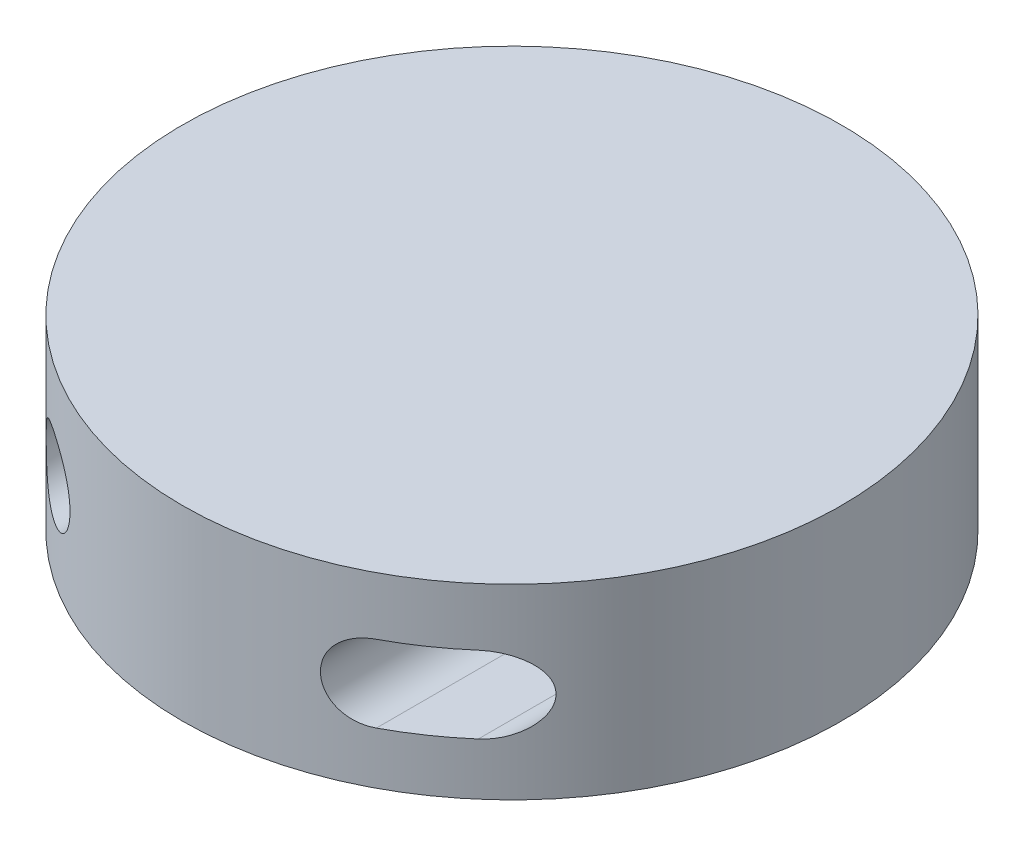
ISO-10303-21;
HEADER;
FILE_DESCRIPTION(('STEP AP214'),'2;1');
FILE_NAME('part.step','',(''),(''),'','','');
FILE_SCHEMA(('AUTOMOTIVE_DESIGN { 1 0 10303 214 1 1 1 1 }'));
ENDSEC;
DATA;
#1=APPLICATION_CONTEXT('core data for automotive mechanical design processes');
#2=APPLICATION_PROTOCOL_DEFINITION('international standard','automotive_design',2000,#1);
#3=PRODUCT_CONTEXT('',#1,'mechanical');
#4=PRODUCT('Part','Part','',(#3));
#5=PRODUCT_RELATED_PRODUCT_CATEGORY('part','',(#4));
#6=PRODUCT_DEFINITION_FORMATION('','',#4);
#7=PRODUCT_DEFINITION_CONTEXT('part definition',#1,'design');
#8=PRODUCT_DEFINITION('design','',#6,#7);
#9=PRODUCT_DEFINITION_SHAPE('','',#8);
#10=(LENGTH_UNIT() NAMED_UNIT(*) SI_UNIT(.MILLI.,.METRE.));
#11=(NAMED_UNIT(*) PLANE_ANGLE_UNIT() SI_UNIT($,.RADIAN.));
#12=(NAMED_UNIT(*) SI_UNIT($,.STERADIAN.) SOLID_ANGLE_UNIT());
#13=UNCERTAINTY_MEASURE_WITH_UNIT(LENGTH_MEASURE(1.E-05),#10,'distance_accuracy_value','');
#14=(GEOMETRIC_REPRESENTATION_CONTEXT(3) GLOBAL_UNCERTAINTY_ASSIGNED_CONTEXT((#13)) GLOBAL_UNIT_ASSIGNED_CONTEXT((#10,
#11,#12)) REPRESENTATION_CONTEXT('',''));
#15=CARTESIAN_POINT('',(0.,0.,0.));
#16=DIRECTION('',(0.,0.,1.));
#17=DIRECTION('',(1.,0.,0.));
#18=AXIS2_PLACEMENT_3D('',#15,#16,#17);
#19=CARTESIAN_POINT('',(0.,17.,0.));
#20=DIRECTION('',(0.,-1.,0.));
#21=DIRECTION('',(0.,0.,-1.));
#22=AXIS2_PLACEMENT_3D('',#19,#20,#21);
#23=CYLINDRICAL_SURFACE('',#22,30.);
#24=CARTESIAN_POINT('',(-13.375,8.25,26.8534797558901));
#25=CARTESIAN_POINT('',(-13.3750006085543,8.15989832893413,26.8534795461278));
#26=CARTESIAN_POINT('',(-13.378484547308,8.06976448026353,26.8517450740264));
#27=CARTESIAN_POINT('',(-13.3923834220039,7.89012802276604,26.8448155995292));
#28=CARTESIAN_POINT('',(-13.402802792603,7.80062585487796,26.8396183829817));
#29=CARTESIAN_POINT('',(-13.4304858445202,7.62275725371299,26.8257766209072));
#30=CARTESIAN_POINT('',(-13.4477635779207,7.53439353920119,26.8171249974394));
#31=CARTESIAN_POINT('',(-13.4889544337503,7.35962123018778,26.7964294711437));
#32=CARTESIAN_POINT('',(-13.5128702044937,7.27321343093105,26.7843842143614));
#33=CARTESIAN_POINT('',(-13.5940353256864,7.01837474826386,26.7433341383886));
#34=CARTESIAN_POINT('',(-13.6608109903343,6.85364543359958,26.709361660511));
#35=CARTESIAN_POINT('',(-13.8168012697818,6.53875871413869,26.6289999991809));
#36=CARTESIAN_POINT('',(-13.9060050911439,6.38859434806712,26.582616787644));
#37=CARTESIAN_POINT('',(-14.1067057308018,6.10097609463532,26.4766712199183));
#38=CARTESIAN_POINT('',(-14.2188522167683,5.9641206721476,26.4167175877796));
#39=CARTESIAN_POINT('',(-14.4592285704137,5.71139639870356,26.2859169042239));
#40=CARTESIAN_POINT('',(-14.5874648115339,5.5955359089179,26.2150655334906));
#41=CARTESIAN_POINT('',(-14.8688479498061,5.3759455329429,26.0565888058858));
#42=CARTESIAN_POINT('',(-15.0232045441075,5.27446250540006,25.9680047851412));
#43=CARTESIAN_POINT('',(-15.3413126852528,5.09866990538831,25.781353601983));
#44=CARTESIAN_POINT('',(-15.5050686321898,5.02437318158694,25.6832819831969));
#45=CARTESIAN_POINT('',(-15.8597634303481,4.89447772221324,25.465989338309));
#46=CARTESIAN_POINT('',(-16.0514260835634,4.84266791668128,25.3456886805502));
#47=CARTESIAN_POINT('',(-16.4361362641726,4.77211231735737,25.097926305013));
#48=CARTESIAN_POINT('',(-16.6291843790085,4.7533814964709,24.9704613713101));
#49=CARTESIAN_POINT('',(-17.0403806308222,4.74702562010607,24.6920142608062));
#50=CARTESIAN_POINT('',(-17.2581132663381,4.76430017945123,24.5403003661391));
#51=CARTESIAN_POINT('',(-17.6851978459055,4.83816339624804,24.2343345258666));
#52=CARTESIAN_POINT('',(-17.8945401877523,4.89479581004366,24.0800799421641));
#53=CARTESIAN_POINT('',(-18.321210394306,5.05382446177827,23.7573538790111));
#54=CARTESIAN_POINT('',(-18.5371499827713,5.16032371103248,23.589049489279));
#55=CARTESIAN_POINT('',(-18.9471732475285,5.4189643272931,23.2609826602666));
#56=CARTESIAN_POINT('',(-19.1412797024555,5.57105750692799,23.1012114114778));
#57=CARTESIAN_POINT('',(-19.4479991670684,5.87062206536827,22.8430149986638));
#58=CARTESIAN_POINT('',(-19.5679732585505,6.00678452394128,22.740183400783));
#59=CARTESIAN_POINT('',(-19.7888125603394,6.30227846617808,22.5482633638481));
#60=CARTESIAN_POINT('',(-19.889709761342,6.4615703555877,22.4591519643737));
#61=CARTESIAN_POINT('',(-20.0492221270893,6.76754662629084,22.3167596806831));
#62=CARTESIAN_POINT('',(-20.1122632577135,6.91020206948808,22.2598775729525));
#63=CARTESIAN_POINT('',(-20.1929464269122,7.13308696830649,22.186622812435));
#64=CARTESIAN_POINT('',(-20.2175319781993,7.20888488972842,22.1642120154209));
#65=CARTESIAN_POINT('',(-20.2617039251027,7.36306320080592,22.1238389767591));
#66=CARTESIAN_POINT('',(-20.2812925451464,7.44144242376584,22.1058747557853));
#67=CARTESIAN_POINT('',(-20.3152633562353,7.60093186261333,22.0746599739961));
#68=CARTESIAN_POINT('',(-20.32960240696,7.68205897295832,22.0614484852833));
#69=CARTESIAN_POINT('',(-20.3525591696462,7.84576003684197,22.0402717698372));
#70=CARTESIAN_POINT('',(-20.3611796325105,7.92833327507659,22.0323040206398));
#71=CARTESIAN_POINT('',(-20.372518826463,8.09421951699231,22.0218196212186));
#72=CARTESIAN_POINT('',(-20.3752387523999,8.17753236747157,22.0193018673803));
#73=CARTESIAN_POINT('',(-20.3747278335006,8.34409617273757,22.0197742270904));
#74=CARTESIAN_POINT('',(-20.3714975497451,8.42734713261982,22.0227638213181));
#75=CARTESIAN_POINT('',(-20.3544239445001,8.65613696709693,22.0385503723705));
#76=CARTESIAN_POINT('',(-20.3343775374624,8.8008951962887,22.0570768934089));
#77=CARTESIAN_POINT('',(-20.2772667575004,9.08396493848451,22.1095886778627));
#78=CARTESIAN_POINT('',(-20.2401995051012,9.22227535632742,22.1435765569201));
#79=CARTESIAN_POINT('',(-20.1492359762182,9.49536530556049,22.2263851901351));
#80=CARTESIAN_POINT('',(-20.0947079617872,9.6297631786597,22.2757605032959));
#81=CARTESIAN_POINT('',(-19.9718626091719,9.88701263083299,22.3859672140823));
#82=CARTESIAN_POINT('',(-19.9035355204372,10.0098559548868,22.4468067103563));
#83=CARTESIAN_POINT('',(-19.7172593987128,10.3031205218631,22.6108793674696));
#84=CARTESIAN_POINT('',(-19.591837358874,10.465615017751,22.7198479627103));
#85=CARTESIAN_POINT('',(-19.3206815918222,10.7617942659808,22.950885218943));
#86=CARTESIAN_POINT('',(-19.1749115636024,10.8954264176926,23.0729772006289));
#87=CARTESIAN_POINT('',(-18.8647832025201,11.1361674007112,23.3272559273983));
#88=CARTESIAN_POINT('',(-18.7001328696394,11.2427445590179,23.4595867954707));
#89=CARTESIAN_POINT('',(-18.358171105796,11.4261390356851,23.728145788852));
#90=CARTESIAN_POINT('',(-18.1808623994736,11.502962735566,23.8643730717196));
#91=CARTESIAN_POINT('',(-17.7785293910172,11.6393394849644,24.1660788196871));
#92=CARTESIAN_POINT('',(-17.5512565570691,11.691966666733,24.3317422913823));
#93=CARTESIAN_POINT('',(-17.087893219412,11.7513331852091,24.6593722410742));
#94=CARTESIAN_POINT('',(-16.8517940233101,11.7580260203218,24.8213348072436));
#95=CARTESIAN_POINT('',(-16.3718661410268,11.7221593472552,25.1405349350899));
#96=CARTESIAN_POINT('',(-16.1279829649205,11.6784900174798,25.297584613309));
#97=CARTESIAN_POINT('',(-15.767872588893,11.5726406592427,25.5224305546512));
#98=CARTESIAN_POINT('',(-15.6488128402989,11.5306464936307,25.5955767292465));
#99=CARTESIAN_POINT('',(-15.4139142320196,11.4329874849099,25.7377164328236));
#100=CARTESIAN_POINT('',(-15.2980741795603,11.3773277815766,25.8067115109641));
#101=CARTESIAN_POINT('',(-15.0179672254839,11.2227984959595,25.971095694598));
#102=CARTESIAN_POINT('',(-14.8563694741901,11.1158917646692,26.0637503451786));
#103=CARTESIAN_POINT('',(-14.6261835229816,10.93373695706,26.1931785651612));
#104=CARTESIAN_POINT('',(-14.5514711801066,10.8693655997219,26.2347390944075));
#105=CARTESIAN_POINT('',(-14.4068339960645,10.733541486684,26.3144432146666));
#106=CARTESIAN_POINT('',(-14.3369068847318,10.6620921287988,26.3525884286281));
#107=CARTESIAN_POINT('',(-14.2022187318668,10.5119627032911,26.4254212854107));
#108=CARTESIAN_POINT('',(-14.1374911752455,10.4332418542447,26.4600868284093));
#109=CARTESIAN_POINT('',(-14.0144984343222,10.2694096508556,26.5254345998643));
#110=CARTESIAN_POINT('',(-13.9562303316726,10.1843012117794,26.5561186282254));
#111=CARTESIAN_POINT('',(-13.8468751115323,10.0081837424929,26.6133023567091));
#112=CARTESIAN_POINT('',(-13.7957921028788,9.91717137920437,26.6397996636908));
#113=CARTESIAN_POINT('',(-13.7015838686467,9.73000080543968,26.6883759537258));
#114=CARTESIAN_POINT('',(-13.6584573480439,9.6338434356742,26.7104556558525));
#115=CARTESIAN_POINT('',(-13.5848360535342,9.44741375863056,26.7479673009565));
#116=CARTESIAN_POINT('',(-13.5534950775508,9.35756544260158,26.7638512114824));
#117=CARTESIAN_POINT('',(-13.498118803225,9.17507407255906,26.7918224977481));
#118=CARTESIAN_POINT('',(-13.4740825936254,9.08243136872694,26.8039103470463));
#119=CARTESIAN_POINT('',(-13.4336821205048,8.89534275060593,26.824181154422));
#120=CARTESIAN_POINT('',(-13.4172969732283,8.80090248584353,26.8323747430811));
#121=CARTESIAN_POINT('',(-13.3923268204297,8.61078722391534,26.8448464223469));
#122=CARTESIAN_POINT('',(-13.3837362000981,8.51511316598419,26.8491273314796));
#123=CARTESIAN_POINT('',(-13.3777296321615,8.39105876874744,26.8521200350975));
#124=CARTESIAN_POINT('',(-13.376706291332,8.36286009712272,26.8526298397703));
#125=CARTESIAN_POINT('',(-13.3753413796651,8.3064420026932,26.8533097331568));
#126=CARTESIAN_POINT('',(-13.3749998093823,8.27822257987154,26.853479821594));
#127=CARTESIAN_POINT('',(-13.375,8.25,26.8534797558901));
#128=B_SPLINE_CURVE_WITH_KNOTS('',3,(#24,#25,#26,#27,#28,#29,#30,#31,#32,#33,#34,#35,#36,#37,
#38,#39,#40,#41,#42,#43,#44,#45,#46,#47,#48,#49,#50,#51,#52,#53,#54,#55,#56,#57,#58,#59,#60,#61,
#62,#63,#64,#65,#66,#67,#68,#69,#70,#71,#72,#73,#74,#75,#76,#77,#78,#79,#80,#81,#82,#83,#84,#85,
#86,#87,#88,#89,#90,#91,#92,#93,#94,#95,#96,#97,#98,#99,#100,#101,#102,#103,#104,#105,#106,#107,
#108,#109,#110,#111,#112,#113,#114,#115,#116,#117,#118,#119,#120,#121,#122,#123,#124,#125,#126,
#127),.UNSPECIFIED.,.T.,.F.,(4,2,2,2,2,2,2,2,2,2,2,2,2,2,2,2,2,2,2,2,2,2,2,2,2,2,2,2,2,2,2,2,2,
2,2,2,2,2,2,2,2,2,2,2,2,2,2,2,2,2,2,4),(0.,0.270276437010964,0.540725860531264,
0.811732291287802,1.08284699868935,1.62302165554073,2.16293685197357,2.72103729442579,
3.27935951260759,3.89151665144005,4.50396273266137,5.197670754637,5.89169269691956,
6.68626164276179,7.48171537175726,8.35887117309342,9.23510317381119,9.85871882477261,
10.481279253418,10.9771733087022,11.2252398826844,11.4731958341965,11.7231459978447,
11.9729758366574,12.2227550806276,12.4725107726285,12.9122117185885,13.3519870776883,
13.8099227472351,14.2681831375948,14.9615641903012,15.6561984382172,16.3635786304234,
17.0708070196229,17.925280689476,18.7806192575573,19.6551728337727,20.0922642596322,
20.5291915412378,21.1703176258005,21.491056561816,21.8116422655174,22.1341499414025,
22.4565113110159,22.779056281798,23.1015487076953,23.3905934923782,23.6796022044035,
23.967817381411,24.2558247765823,24.3404834964021,24.4251422850872),.UNSPECIFIED.);
#129=CARTESIAN_POINT('',(-13.375,8.25,26.8534797558901));
#130=VERTEX_POINT('',#129);
#131=EDGE_CURVE('E36',#130,#130,#128,.T.);
#132=ORIENTED_EDGE('',*,*,#131,.T.);
#133=EDGE_LOOP('',(#132));
#134=FACE_BOUND('',#133,.T.);
#135=CARTESIAN_POINT('',(0.,4.75,0.));
#136=DIRECTION('',(0.,-1.,0.));
#137=DIRECTION('',(1.,0.,0.));
#138=AXIS2_PLACEMENT_3D('',#135,#136,#137);
#139=CIRCLE('',#138,30.);
#140=CARTESIAN_POINT('',(19.625,4.75,22.6905128853448));
#141=VERTEX_POINT('',#140);
#142=CARTESIAN_POINT('',(14.125,4.75,26.4666653547439));
#143=VERTEX_POINT('',#142);
#144=EDGE_CURVE('E116',#141,#143,#139,.T.);
#145=ORIENTED_EDGE('',*,*,#144,.T.);
#146=CARTESIAN_POINT('',(17.625,8.25,24.2767249644593));
#147=CARTESIAN_POINT('',(17.6249915327424,8.07874178754923,24.2767324106197));
#148=CARTESIAN_POINT('',(17.6123495166612,7.90741346114438,24.2859246818278));
#149=CARTESIAN_POINT('',(17.5625889713853,7.57022308508132,24.3219317025267));
#150=CARTESIAN_POINT('',(17.5254509866952,7.40436549048981,24.3487604594314));
#151=CARTESIAN_POINT('',(17.4291423105093,7.08356363657638,24.417789632859));
#152=CARTESIAN_POINT('',(17.3700782703783,6.92857079848767,24.459915620257));
#153=CARTESIAN_POINT('',(17.2327293193733,6.63172926045215,24.5568744306631));
#154=CARTESIAN_POINT('',(17.1544399092792,6.48988364800538,24.6117102279175));
#155=CARTESIAN_POINT('',(16.9745469005455,6.21042161906358,24.7361602978755));
#156=CARTESIAN_POINT('',(16.8715738711171,6.07406478105455,24.8066088734887));
#157=CARTESIAN_POINT('',(16.6498128769615,5.82023421008205,24.9559938569243));
#158=CARTESIAN_POINT('',(16.5310176551257,5.70276919706997,25.0349341564005));
#159=CARTESIAN_POINT('',(16.2575049154031,5.46781075195524,25.2135833274207));
#160=CARTESIAN_POINT('',(16.1001877675538,5.35422194879546,25.3144537279002));
#161=CARTESIAN_POINT('',(15.771230412713,5.15534147196161,25.5206985121239));
#162=CARTESIAN_POINT('',(15.5995804228004,5.07006932677572,25.6260759478282));
#163=CARTESIAN_POINT('',(15.2209292692829,4.9189263544131,25.8530167197955));
#164=CARTESIAN_POINT('',(15.0123249832596,4.85737966882573,25.9748000196181));
#165=CARTESIAN_POINT('',(14.586073874289,4.77371790889112,26.216528618252));
#166=CARTESIAN_POINT('',(14.3684238462752,4.75161693486339,26.3364732446254));
#167=CARTESIAN_POINT('',(14.0360611190732,4.74929234584716,26.5142536960435));
#168=CARTESIAN_POINT('',(13.9223705011345,4.75400449554783,26.5741236148576));
#169=CARTESIAN_POINT('',(13.6950502567394,4.7746367046222,26.6919825946949));
#170=CARTESIAN_POINT('',(13.5814206252825,4.79055188247821,26.7499724634081));
#171=CARTESIAN_POINT('',(13.3551480682295,4.83377373458271,26.8636570260063));
#172=CARTESIAN_POINT('',(13.2425053876745,4.86108316030881,26.919351161947));
#173=CARTESIAN_POINT('',(13.0193466699713,4.92719070044892,27.027985440662));
#174=CARTESIAN_POINT('',(12.9088294784788,4.96598237983749,27.0809271065233));
#175=CARTESIAN_POINT('',(12.6983452321224,5.05207833937722,27.1802253675503));
#176=CARTESIAN_POINT('',(12.5981683512933,5.098635187649,27.2267853953233));
#177=CARTESIAN_POINT('',(12.4016673543978,5.20165255565206,27.3168504817777));
#178=CARTESIAN_POINT('',(12.3053412572517,5.25810790032744,27.3603571202466));
#179=CARTESIAN_POINT('',(12.1175724693731,5.38071383348168,27.4440339920101));
#180=CARTESIAN_POINT('',(12.0261282050451,5.4468612717798,27.4842053027508));
#181=CARTESIAN_POINT('',(11.8491773490315,5.58852085449918,27.5609560168445));
#182=CARTESIAN_POINT('',(11.7636700688258,5.66403191017001,27.5975358369118));
#183=CARTESIAN_POINT('',(11.6083380990157,5.81547597683788,27.6632035815999));
#184=CARTESIAN_POINT('',(11.5378106867169,5.89052350766321,27.6926747515946));
#185=CARTESIAN_POINT('',(11.4031382042459,6.04724279355189,27.7484008511111));
#186=CARTESIAN_POINT('',(11.3389924000392,6.12891378479583,27.7746561506138));
#187=CARTESIAN_POINT('',(11.21783234215,6.29827938376075,27.8238119731453));
#188=CARTESIAN_POINT('',(11.1608151459323,6.38597148278762,27.8467138810542));
#189=CARTESIAN_POINT('',(11.0545579455264,6.56673686371165,27.8890663539822));
#190=CARTESIAN_POINT('',(11.0053174259698,6.659809788457,27.9085171477207));
#191=CARTESIAN_POINT('',(10.91907244055,6.84240142950921,27.9423659782001));
#192=CARTESIAN_POINT('',(10.8813815213439,6.93154289421856,27.9570539401529));
#193=CARTESIAN_POINT('',(10.8133860420787,7.1130696202714,27.9834238945157));
#194=CARTESIAN_POINT('',(10.7830840844879,7.20545601144214,27.9951048278998));
#195=CARTESIAN_POINT('',(10.7302289429729,7.39268998651519,28.0154063525641));
#196=CARTESIAN_POINT('',(10.7076707360315,7.48753593190465,28.0240289277826));
#197=CARTESIAN_POINT('',(10.6705101622809,7.67900906444331,28.0381988327244));
#198=CARTESIAN_POINT('',(10.6559106481867,7.77563687747222,28.0437450597733));
#199=CARTESIAN_POINT('',(10.6253294192821,8.05793616710222,28.055355023212));
#200=CARTESIAN_POINT('',(10.6200483036487,8.2450717070401,28.0573468410435));
#201=CARTESIAN_POINT('',(10.6393453923684,8.61745207170573,28.0500339548692));
#202=CARTESIAN_POINT('',(10.6639199435387,8.80269712495955,28.0407306329531));
#203=CARTESIAN_POINT('',(10.7414477481729,9.16393635739614,28.0111224560715));
#204=CARTESIAN_POINT('',(10.7940626896457,9.34001390700136,27.9909487229383));
#205=CARTESIAN_POINT('',(10.9254471426993,9.68044203806996,27.939927300153));
#206=CARTESIAN_POINT('',(11.0042174253912,9.84479227361537,27.909079295801));
#207=CARTESIAN_POINT('',(11.1866895617853,10.1605469250552,27.8364465228661));
#208=CARTESIAN_POINT('',(11.2908250312976,10.3116561638139,27.7944702751148));
#209=CARTESIAN_POINT('',(11.5194765038497,10.5939857439069,27.7004857470809));
#210=CARTESIAN_POINT('',(11.6439958962359,10.7252027706539,27.6484757981829));
#211=CARTESIAN_POINT('',(11.9158009511313,10.9711488988994,27.5324630971139));
#212=CARTESIAN_POINT('',(12.0639030112545,11.0847555359216,27.4679976900271));
#213=CARTESIAN_POINT('',(12.3731606019223,11.2856376478425,27.3300855062199));
#214=CARTESIAN_POINT('',(12.5343200352708,11.3729052129805,27.2566360408271));
#215=CARTESIAN_POINT('',(12.8781633044328,11.5262121086677,27.0959709693251));
#216=CARTESIAN_POINT('',(13.0615418125103,11.5900301319404,27.0081262584474));
#217=CARTESIAN_POINT('',(13.4329207029104,11.6862585409711,26.8253526935291));
#218=CARTESIAN_POINT('',(13.6209229586179,11.7186559738377,26.730420935262));
#219=CARTESIAN_POINT('',(14.015458092701,11.7544216529642,26.5258543641269));
#220=CARTESIAN_POINT('',(14.2220029249984,11.7546368447021,26.4156900515818));
#221=CARTESIAN_POINT('',(14.6301036215238,11.7194199195105,26.191875449121));
#222=CARTESIAN_POINT('',(14.8316574033398,11.6839731718421,26.0782237470152));
#223=CARTESIAN_POINT('',(15.2417422438521,11.5743918742955,25.8408573149));
#224=CARTESIAN_POINT('',(15.44945698262,11.4972818643138,25.7170926070915));
#225=CARTESIAN_POINT('',(15.8485490093859,11.3042782303738,25.4730902519276));
#226=CARTESIAN_POINT('',(16.039912382097,11.1883519777371,25.3528556647638));
#227=CARTESIAN_POINT('',(16.4019504368544,10.9177417887423,25.1201622515536));
#228=CARTESIAN_POINT('',(16.5724559967233,10.7627686813423,25.0077698059023));
#229=CARTESIAN_POINT('',(16.8056351790924,10.5033803477755,24.8511469158973));
#230=CARTESIAN_POINT('',(16.8795804862233,10.4124592591604,24.8009462099949));
#231=CARTESIAN_POINT('',(17.0189988805867,10.221975544604,24.7054808166392));
#232=CARTESIAN_POINT('',(17.0844760962932,10.1224171694835,24.6602137255918));
#233=CARTESIAN_POINT('',(17.2296282938678,9.87455778971221,24.5591227520322));
#234=CARTESIAN_POINT('',(17.3048341257715,9.72242707158143,24.5060985261222));
#235=CARTESIAN_POINT('',(17.433286050992,9.40517579648276,24.4148888574956));
#236=CARTESIAN_POINT('',(17.4865692030825,9.24007772739974,24.3766783795288));
#237=CARTESIAN_POINT('',(17.5595336670665,8.93753737082175,24.3241511527349));
#238=CARTESIAN_POINT('',(17.5839861855037,8.80182090124116,24.3064566733539));
#239=CARTESIAN_POINT('',(17.6167232860054,8.52741841442701,24.2827401990317));
#240=CARTESIAN_POINT('',(17.6250068591243,8.38873221242739,24.2767189325014));
#241=CARTESIAN_POINT('',(17.625,8.25,24.2767249644593));
#242=B_SPLINE_CURVE_WITH_KNOTS('',3,(#146,#147,#148,#149,#150,#151,#152,#153,#154,#155,#156,
#157,#158,#159,#160,#161,#162,#163,#164,#165,#166,#167,#168,#169,#170,#171,#172,#173,#174,#175,
#176,#177,#178,#179,#180,#181,#182,#183,#184,#185,#186,#187,#188,#189,#190,#191,#192,#193,#194,
#195,#196,#197,#198,#199,#200,#201,#202,#203,#204,#205,#206,#207,#208,#209,#210,#211,#212,#213,
#214,#215,#216,#217,#218,#219,#220,#221,#222,#223,#224,#225,#226,#227,#228,#229,#230,#231,#232,
#233,#234,#235,#236,#237,#238,#239,#240,#241),.UNSPECIFIED.,.T.,.F.,(4,2,2,2,2,2,2,2,2,2,2,2,2,
2,2,2,2,2,2,2,2,2,2,2,2,2,2,2,2,2,2,2,2,2,2,2,2,2,2,2,2,2,2,2,2,2,2,4),(0.,0.513211164894444,
1.02683043040256,1.53798343534557,2.0492561771361,2.60168511245488,3.15436830661485,
3.8078838832837,4.46184922328705,5.20640924377926,5.95123536247823,6.33655039870458,
6.72169764468992,7.10693794972866,7.49196276113607,7.8511080684501,8.21006616702951,
8.56890785270378,8.92770785327612,9.24864333347924,9.56954185579231,9.89030747771297,
10.211051833235,10.5043530927483,10.79775750725,11.090971242491,11.3842900083166,
11.9429934219006,12.5016284786108,13.0536712260623,13.6057302502701,14.1679858412205,
14.7303350166198,15.3202297976816,15.9103015513639,16.5469829047897,17.1839266136728,
17.8832376791516,18.5828357624335,19.3406832061075,20.0991692973494,20.863446713744,
21.2453673806144,21.6271011409498,22.158198529409,22.6883944088416,23.1041086506336,
23.5198488322539),.UNSPECIFIED.);
#243=CARTESIAN_POINT('',(14.125,11.75,26.4666653547439));
#244=VERTEX_POINT('',#243);
#245=EDGE_CURVE('E45',#143,#244,#242,.T.);
#246=ORIENTED_EDGE('',*,*,#245,.T.);
#247=CARTESIAN_POINT('',(0.,11.75,0.));
#248=DIRECTION('',(0.,1.,0.));
#249=DIRECTION('',(-1.,0.,0.));
#250=AXIS2_PLACEMENT_3D('',#247,#248,#249);
#251=CIRCLE('',#250,30.);
#252=CARTESIAN_POINT('',(19.625,11.75,22.6905128853448));
#253=VERTEX_POINT('',#252);
#254=EDGE_CURVE('E61',#244,#253,#251,.T.);
#255=ORIENTED_EDGE('',*,*,#254,.T.);
#256=CARTESIAN_POINT('',(23.125,8.25,19.1111060642758));
#257=CARTESIAN_POINT('',(23.1250011215563,8.17515893842453,19.1111045811121));
#258=CARTESIAN_POINT('',(23.1225942846866,8.1003265145028,19.1140181337319));
#259=CARTESIAN_POINT('',(23.1130361833795,7.95138009535795,19.1255748979805));
#260=CARTESIAN_POINT('',(23.1058828879711,7.8772664214619,19.1342205623322));
#261=CARTESIAN_POINT('',(23.0870050969046,7.73037353929845,19.1569938296284));
#262=CARTESIAN_POINT('',(23.075274064205,7.65759639592006,19.1711292718771));
#263=CARTESIAN_POINT('',(23.0475298816166,7.51403395157729,19.2044743869574));
#264=CARTESIAN_POINT('',(23.0315144225236,7.44324974756624,19.2236867960853));
#265=CARTESIAN_POINT('',(22.9779331962944,7.23610256396437,19.287759221926));
#266=CARTESIAN_POINT('',(22.9346004164863,7.10323781718121,19.339337639202));
#267=CARTESIAN_POINT('',(22.8353439604345,6.84915047766651,19.4564377996357));
#268=CARTESIAN_POINT('',(22.7794156853179,6.72793216040534,19.5219646351662));
#269=CARTESIAN_POINT('',(22.6237916064973,6.43392830566648,19.7024058964631));
#270=CARTESIAN_POINT('',(22.5169317567923,6.26940227244731,19.8246746791977));
#271=CARTESIAN_POINT('',(22.3433250775479,6.04324069037955,20.0195794942811));
#272=CARTESIAN_POINT('',(22.2831192859284,5.97118318940873,20.0865924616548));
#273=CARTESIAN_POINT('',(22.158768923752,5.83368136800308,20.2236862818432));
#274=CARTESIAN_POINT('',(22.0946254005192,5.76823530126206,20.2937663174941));
#275=CARTESIAN_POINT('',(21.9355039132314,5.61788273671973,20.4658869378407));
#276=CARTESIAN_POINT('',(21.83878277661,5.53618094515224,20.5691145961997));
#277=CARTESIAN_POINT('',(21.6393833293257,5.38505473095017,20.7787882778419));
#278=CARTESIAN_POINT('',(21.5367026681694,5.31563519686006,20.8852355629407));
#279=CARTESIAN_POINT('',(21.3261362024204,5.18875013099725,21.1002029123103));
#280=CARTESIAN_POINT('',(21.2182476048988,5.13129110318569,21.208724069489));
#281=CARTESIAN_POINT('',(20.9979968247425,5.02825197448034,21.4268093064904));
#282=CARTESIAN_POINT('',(20.8856352047038,4.98267038510524,21.536373253845));
#283=CARTESIAN_POINT('',(20.6547396174796,4.90263470953466,21.7579366298024));
#284=CARTESIAN_POINT('',(20.536127408068,4.86841942017817,21.8699412385967));
#285=CARTESIAN_POINT('',(20.2954893540769,4.81260056610739,22.0934420782757));
#286=CARTESIAN_POINT('',(20.1734622275231,4.79100180609177,22.2049380994604));
#287=CARTESIAN_POINT('',(19.8034736394601,4.74574327256412,22.5373389233462));
#288=CARTESIAN_POINT('',(19.5511891296638,4.74147616403435,22.756556427978));
#289=CARTESIAN_POINT('',(19.0805185289606,4.78578048012207,23.1519774405685));
#290=CARTESIAN_POINT('',(18.8626752756389,4.8265827839565,23.3297271110763));
#291=CARTESIAN_POINT('',(18.4300413741109,4.95262543251661,23.6729673409758));
#292=CARTESIAN_POINT('',(18.2152476437368,5.03781705544338,23.8384711144923));
#293=CARTESIAN_POINT('',(17.8381647133379,5.23450763960158,24.1214490910197));
#294=CARTESIAN_POINT('',(17.6738132213764,5.33762098361449,24.2419912533316));
#295=CARTESIAN_POINT('',(17.3586547091679,5.57557103543219,24.4686460959977));
#296=CARTESIAN_POINT('',(17.2078330216805,5.71037280229299,24.5747744676706));
#297=CARTESIAN_POINT('',(16.9486309297497,5.98786481672376,24.7540875974545));
#298=CARTESIAN_POINT('',(16.8372948155998,6.12610302849097,24.8298288696225));
#299=CARTESIAN_POINT('',(16.6851007548962,6.34865723240571,24.9321313414758));
#300=CARTESIAN_POINT('',(16.6368201502554,6.42541112430188,24.9643587020946));
#301=CARTESIAN_POINT('',(16.5457935059127,6.58362583306554,25.0247816280994));
#302=CARTESIAN_POINT('',(16.5030451404614,6.66508465101829,25.0529788882606));
#303=CARTESIAN_POINT('',(16.42341937123,6.8327662376504,25.105250096596));
#304=CARTESIAN_POINT('',(16.3865800542766,6.91901543712149,25.1292973658543));
#305=CARTESIAN_POINT('',(16.3196634393607,7.09517467688293,25.1728063330663));
#306=CARTESIAN_POINT('',(16.2895829741457,7.18508297905996,25.1922701790554));
#307=CARTESIAN_POINT('',(16.2366504542149,7.36787745014754,25.226418210899));
#308=CARTESIAN_POINT('',(16.2137974491818,7.4607632257885,25.2411030251417));
#309=CARTESIAN_POINT('',(16.1757028904246,7.64871729923149,25.2655328532499));
#310=CARTESIAN_POINT('',(16.1604605113936,7.74378535921355,25.275278402738));
#311=CARTESIAN_POINT('',(16.139025332592,7.92527984234137,25.2889700010658));
#312=CARTESIAN_POINT('',(16.1320570302198,8.01157823716086,25.2934132818707));
#313=CARTESIAN_POINT('',(16.1245395235843,8.18459905191822,25.298206367707));
#314=CARTESIAN_POINT('',(16.1239925060808,8.27132160624534,25.2985547782359));
#315=CARTESIAN_POINT('',(16.1293332905628,8.44443311770383,25.2951501188382));
#316=CARTESIAN_POINT('',(16.1352167436183,8.53082226069127,25.2913998208699));
#317=CARTESIAN_POINT('',(16.1533186513899,8.70266977377645,25.2798418293135));
#318=CARTESIAN_POINT('',(16.1655394482339,8.78812778782137,25.2720326356541));
#319=CARTESIAN_POINT('',(16.2102726342979,9.03540151291806,25.2433821457129));
#320=CARTESIAN_POINT('',(16.2511112512394,9.19519548245281,25.217160014629));
#321=CARTESIAN_POINT('',(16.353581016313,9.5047784158287,25.1508262683514));
#322=CARTESIAN_POINT('',(16.4152140077037,9.65456649131505,25.1107134218461));
#323=CARTESIAN_POINT('',(16.5596717309567,9.94752809639269,25.0156960071597));
#324=CARTESIAN_POINT('',(16.6433229916648,10.0901035905518,24.9602086785389));
#325=CARTESIAN_POINT('',(16.8267057363844,10.35855847729,24.8369516516965));
#326=CARTESIAN_POINT('',(16.9264430106048,10.4844318280332,24.7691775297128));
#327=CARTESIAN_POINT('',(17.1505810972644,10.7315672175397,24.614591406853));
#328=CARTESIAN_POINT('',(17.2764989762973,10.8506384314036,24.5264867905856));
#329=CARTESIAN_POINT('',(17.5392555774147,11.0657688069947,24.3392807251794));
#330=CARTESIAN_POINT('',(17.676099993383,11.1618158649822,24.2401735318917));
#331=CARTESIAN_POINT('',(17.9807874747855,11.3457064252466,24.0152638137427));
#332=CARTESIAN_POINT('',(18.1499318158781,11.4293437401301,23.8877934817814));
#333=CARTESIAN_POINT('',(18.4927484103038,11.5669539487577,23.623405050848));
#334=CARTESIAN_POINT('',(18.6664232761158,11.6209093121368,23.4864814223024));
#335=CARTESIAN_POINT('',(19.0502667646226,11.7091935068807,23.1767090255422));
#336=CARTESIAN_POINT('',(19.2605986446204,11.7372082891185,23.0022610550519));
#337=CARTESIAN_POINT('',(19.6773211664121,11.7558315424426,22.6468178107024));
#338=CARTESIAN_POINT('',(19.8837082824926,11.7464079915234,22.4658170632331));
#339=CARTESIAN_POINT('',(20.3287558914018,11.687225135541,22.0646270240036));
#340=CARTESIAN_POINT('',(20.5658142646111,11.6299226903503,21.8437095366562));
#341=CARTESIAN_POINT('',(20.9093239449911,11.5081108904169,21.5133841082199));
#342=CARTESIAN_POINT('',(21.0218888886046,11.4614852929757,21.4033739832225));
#343=CARTESIAN_POINT('',(21.2424564621816,11.3562454790776,21.184477713055));
#344=CARTESIAN_POINT('',(21.3504599920993,11.2976336409306,21.0755913494036));
#345=CARTESIAN_POINT('',(21.5444415431076,11.1785757524553,20.8770961190285));
#346=CARTESIAN_POINT('',(21.6311918541958,11.1199019917597,20.7871740499964));
#347=CARTESIAN_POINT('',(21.8005108356345,10.9937743984672,20.6095311505529));
#348=CARTESIAN_POINT('',(21.8830791960669,10.9263199164632,20.5218104835265));
#349=CARTESIAN_POINT('',(22.0433216789433,10.7824491202336,20.3495891281223));
#350=CARTESIAN_POINT('',(22.1210028884321,10.7060462654131,20.2650838507668));
#351=CARTESIAN_POINT('',(22.2708153859962,10.5438700326021,20.1003279554478));
#352=CARTESIAN_POINT('',(22.3429491085268,10.4581008053964,20.0200754760527));
#353=CARTESIAN_POINT('',(22.5032765625225,10.2470928369989,19.8398938699552));
#354=CARTESIAN_POINT('',(22.5890259927749,10.1181095743427,19.7420935962813));
#355=CARTESIAN_POINT('',(22.7459206408072,9.8421540954578,19.561120187577));
#356=CARTESIAN_POINT('',(22.8170850001387,9.69520586647265,19.4779279017381));
#357=CARTESIAN_POINT('',(22.9270809758616,9.41767088332451,19.3482447735502));
#358=CARTESIAN_POINT('',(22.9695776904235,9.29045174728764,19.2977071795553));
#359=CARTESIAN_POINT('',(23.0403758613255,9.02697183651849,19.2131247248079));
#360=CARTESIAN_POINT('',(23.0687097071418,8.89073250660846,19.1790422385435));
#361=CARTESIAN_POINT('',(23.1007743579452,8.66944763542704,19.14039061592));
#362=CARTESIAN_POINT('',(23.1098274485591,8.5862271421861,19.1294526100734));
#363=CARTESIAN_POINT('',(23.1219403275606,8.41866761250455,19.1148103372238));
#364=CARTESIAN_POINT('',(23.1249987362691,8.33432832306797,19.1111077354534));
#365=CARTESIAN_POINT('',(23.125,8.25,19.1111060642758));
#366=B_SPLINE_CURVE_WITH_KNOTS('',3,(#256,#257,#258,#259,#260,#261,#262,#263,#264,#265,#266,
#267,#268,#269,#270,#271,#272,#273,#274,#275,#276,#277,#278,#279,#280,#281,#282,#283,#284,#285,
#286,#287,#288,#289,#290,#291,#292,#293,#294,#295,#296,#297,#298,#299,#300,#301,#302,#303,#304,
#305,#306,#307,#308,#309,#310,#311,#312,#313,#314,#315,#316,#317,#318,#319,#320,#321,#322,#323,
#324,#325,#326,#327,#328,#329,#330,#331,#332,#333,#334,#335,#336,#337,#338,#339,#340,#341,#342,
#343,#344,#345,#346,#347,#348,#349,#350,#351,#352,#353,#354,#355,#356,#357,#358,#359,#360,#361,
#362,#363,#364,#365),.UNSPECIFIED.,.T.,.F.,(4,2,2,2,2,2,2,2,2,2,2,2,2,2,2,2,2,2,2,2,2,2,2,2,2,2,
2,2,2,2,2,2,2,2,2,2,2,2,2,2,2,2,2,2,2,2,2,2,2,2,2,2,2,2,4),(0.,0.224414134885351,
0.448924356728126,0.673756360958119,0.898709789305698,1.34345236974985,1.78835759883542,
2.47770441341264,2.82359388593503,3.16939175700394,3.65878831088752,4.14837921674614,
4.63823566398177,5.128030692821,5.62754647687644,6.12725236557088,7.12489848871474,
7.97407113158702,8.82231367827794,9.50491712775111,10.1867714124277,10.7630658758177,
11.0514616845892,11.3397358553761,11.6297992902579,11.9197265142642,12.2096156007295,
12.4994732443835,12.7592247305034,13.0190646720751,13.2787289924686,13.5384893469386,
14.0370336847856,14.5356222263028,15.056574228511,15.5777141691907,16.1587207174305,
16.7400320327796,17.420674880879,18.1017192909305,18.9227549544021,19.7444930227117,
20.7272771181364,21.2193598650008,21.7113450673763,22.1251314451933,22.5389484433528,
22.952150817947,23.3651708159556,23.9130189165632,24.4601433470486,24.8885600907774,
25.3159925412366,25.5687964607253,25.8216585563351),.UNSPECIFIED.);
#367=EDGE_CURVE('E121',#253,#141,#366,.T.);
#368=ORIENTED_EDGE('',*,*,#367,.T.);
#369=EDGE_LOOP('',(#145,#246,#255,#368));
#370=FACE_BOUND('',#369,.T.);
#371=CARTESIAN_POINT('',(0.,17.,0.));
#372=DIRECTION('',(0.,1.,0.));
#373=DIRECTION('',(0.,0.,1.));
#374=AXIS2_PLACEMENT_3D('',#371,#372,#373);
#375=CIRCLE('',#374,30.);
#376=CARTESIAN_POINT('',(0.,17.,30.));
#377=VERTEX_POINT('',#376);
#378=EDGE_CURVE('E113',#377,#377,#375,.T.);
#379=ORIENTED_EDGE('',*,*,#378,.F.);
#380=EDGE_LOOP('',(#379));
#381=FACE_BOUND('',#380,.T.);
#382=CARTESIAN_POINT('',(0.,0.,0.));
#383=DIRECTION('',(0.,1.,0.));
#384=DIRECTION('',(0.,0.,1.));
#385=AXIS2_PLACEMENT_3D('',#382,#383,#384);
#386=CIRCLE('',#385,30.);
#387=CARTESIAN_POINT('',(0.,0.,30.));
#388=VERTEX_POINT('',#387);
#389=EDGE_CURVE('E117',#388,#388,#386,.T.);
#390=ORIENTED_EDGE('',*,*,#389,.T.);
#391=EDGE_LOOP('',(#390));
#392=FACE_BOUND('',#391,.T.);
#393=ADVANCED_FACE('F32',(#134,#370,#381,#392),#23,.T.);
#394=CARTESIAN_POINT('',(0.,17.,0.));
#395=DIRECTION('',(0.,1.,0.));
#396=DIRECTION('',(0.,0.,1.));
#397=AXIS2_PLACEMENT_3D('',#394,#395,#396);
#398=PLANE('',#397);
#399=ORIENTED_EDGE('',*,*,#378,.T.);
#400=EDGE_LOOP('',(#399));
#401=FACE_BOUND('',#400,.T.);
#402=ADVANCED_FACE('F142',(#401),#398,.T.);
#403=CARTESIAN_POINT('',(0.,0.,0.));
#404=DIRECTION('',(0.,1.,0.));
#405=DIRECTION('',(0.,0.,1.));
#406=AXIS2_PLACEMENT_3D('',#403,#404,#405);
#407=PLANE('',#406);
#408=CARTESIAN_POINT('',(0.,0.,0.));
#409=DIRECTION('',(0.,-1.,0.));
#410=DIRECTION('',(0.,0.,-1.));
#411=AXIS2_PLACEMENT_3D('',#408,#409,#410);
#412=CIRCLE('',#411,10.);
#413=CARTESIAN_POINT('',(0.,0.,-10.));
#414=VERTEX_POINT('',#413);
#415=EDGE_CURVE('E11',#414,#414,#412,.T.);
#416=ORIENTED_EDGE('',*,*,#415,.F.);
#417=EDGE_LOOP('',(#416));
#418=FACE_BOUND('',#417,.T.);
#419=ORIENTED_EDGE('',*,*,#389,.F.);
#420=EDGE_LOOP('',(#419));
#421=FACE_BOUND('',#420,.T.);
#422=ADVANCED_FACE('F141',(#418,#421),#407,.F.);
#423=CARTESIAN_POINT('',(14.125,8.25,13.5));
#424=DIRECTION('',(0.,0.,1.));
#425=DIRECTION('',(1.,0.,0.));
#426=AXIS2_PLACEMENT_3D('',#423,#424,#425);
#427=CYLINDRICAL_SURFACE('',#426,3.5);
#428=DIRECTION('',(0.,0.,1.));
#429=VECTOR('',#428,1.);
#430=CARTESIAN_POINT('',(14.125,4.75,13.5));
#431=LINE('',#430,#429);
#432=CARTESIAN_POINT('',(14.125,4.75,13.5));
#433=VERTEX_POINT('',#432);
#434=EDGE_CURVE('E53',#433,#143,#431,.T.);
#435=ORIENTED_EDGE('',*,*,#434,.F.);
#436=CARTESIAN_POINT('',(14.125,8.25,13.5));
#437=DIRECTION('',(0.,0.,1.));
#438=DIRECTION('',(1.,0.,0.));
#439=AXIS2_PLACEMENT_3D('',#436,#437,#438);
#440=CIRCLE('',#439,3.5);
#441=CARTESIAN_POINT('',(14.125,11.75,13.5));
#442=VERTEX_POINT('',#441);
#443=EDGE_CURVE('E81',#442,#433,#440,.T.);
#444=ORIENTED_EDGE('',*,*,#443,.F.);
#445=DIRECTION('',(0.,0.,1.));
#446=VECTOR('',#445,1.);
#447=CARTESIAN_POINT('',(14.125,11.75,13.5));
#448=LINE('',#447,#446);
#449=EDGE_CURVE('E108',#442,#244,#448,.T.);
#450=ORIENTED_EDGE('',*,*,#449,.T.);
#451=ORIENTED_EDGE('',*,*,#245,.F.);
#452=EDGE_LOOP('',(#435,#444,#450,#451));
#453=FACE_BOUND('',#452,.T.);
#454=ADVANCED_FACE('F79',(#453),#427,.F.);
#455=CARTESIAN_POINT('',(14.125,11.75,13.5));
#456=DIRECTION('',(0.,1.,0.));
#457=DIRECTION('',(-1.,0.,0.));
#458=AXIS2_PLACEMENT_3D('',#455,#456,#457);
#459=PLANE('',#458);
#460=ORIENTED_EDGE('',*,*,#449,.F.);
#461=DIRECTION('',(-1.,0.,0.));
#462=VECTOR('',#461,1.);
#463=CARTESIAN_POINT('',(14.125,11.75,13.5));
#464=LINE('',#463,#462);
#465=CARTESIAN_POINT('',(19.625,11.75,13.5));
#466=VERTEX_POINT('',#465);
#467=EDGE_CURVE('E86',#466,#442,#464,.T.);
#468=ORIENTED_EDGE('',*,*,#467,.F.);
#469=DIRECTION('',(0.,0.,1.));
#470=VECTOR('',#469,1.);
#471=CARTESIAN_POINT('',(19.625,11.75,13.5));
#472=LINE('',#471,#470);
#473=EDGE_CURVE('E110',#466,#253,#472,.T.);
#474=ORIENTED_EDGE('',*,*,#473,.T.);
#475=ORIENTED_EDGE('',*,*,#254,.F.);
#476=EDGE_LOOP('',(#460,#468,#474,#475));
#477=FACE_BOUND('',#476,.T.);
#478=ADVANCED_FACE('F133',(#477),#459,.F.);
#479=CARTESIAN_POINT('',(19.625,8.25,13.5));
#480=DIRECTION('',(0.,0.,1.));
#481=DIRECTION('',(1.,0.,0.));
#482=AXIS2_PLACEMENT_3D('',#479,#480,#481);
#483=CYLINDRICAL_SURFACE('',#482,3.5);
#484=ORIENTED_EDGE('',*,*,#473,.F.);
#485=CARTESIAN_POINT('',(19.625,8.25,13.5));
#486=DIRECTION('',(0.,0.,1.));
#487=DIRECTION('',(1.,0.,0.));
#488=AXIS2_PLACEMENT_3D('',#485,#486,#487);
#489=CIRCLE('',#488,3.5);
#490=CARTESIAN_POINT('',(19.625,4.75,13.5));
#491=VERTEX_POINT('',#490);
#492=EDGE_CURVE('E95',#491,#466,#489,.T.);
#493=ORIENTED_EDGE('',*,*,#492,.F.);
#494=DIRECTION('',(0.,0.,1.));
#495=VECTOR('',#494,1.);
#496=CARTESIAN_POINT('',(19.625,4.75,13.5));
#497=LINE('',#496,#495);
#498=EDGE_CURVE('E85',#491,#141,#497,.T.);
#499=ORIENTED_EDGE('',*,*,#498,.T.);
#500=ORIENTED_EDGE('',*,*,#367,.F.);
#501=EDGE_LOOP('',(#484,#493,#499,#500));
#502=FACE_BOUND('',#501,.T.);
#503=ADVANCED_FACE('F128',(#502),#483,.F.);
#504=CARTESIAN_POINT('',(14.125,4.75,13.5));
#505=DIRECTION('',(0.,-1.,0.));
#506=DIRECTION('',(1.,0.,0.));
#507=AXIS2_PLACEMENT_3D('',#504,#505,#506);
#508=PLANE('',#507);
#509=ORIENTED_EDGE('',*,*,#498,.F.);
#510=DIRECTION('',(1.,0.,0.));
#511=VECTOR('',#510,1.);
#512=CARTESIAN_POINT('',(14.125,4.75,13.5));
#513=LINE('',#512,#511);
#514=EDGE_CURVE('E89',#433,#491,#513,.T.);
#515=ORIENTED_EDGE('',*,*,#514,.F.);
#516=ORIENTED_EDGE('',*,*,#434,.T.);
#517=ORIENTED_EDGE('',*,*,#144,.F.);
#518=EDGE_LOOP('',(#509,#515,#516,#517));
#519=FACE_BOUND('',#518,.T.);
#520=ADVANCED_FACE('F90',(#519),#508,.F.);
#521=CARTESIAN_POINT('',(14.125,8.25,13.5));
#522=DIRECTION('',(0.,0.,1.));
#523=DIRECTION('',(1.,0.,0.));
#524=AXIS2_PLACEMENT_3D('',#521,#522,#523);
#525=PLANE('',#524);
#526=ORIENTED_EDGE('',*,*,#443,.T.);
#527=ORIENTED_EDGE('',*,*,#514,.T.);
#528=ORIENTED_EDGE('',*,*,#492,.T.);
#529=ORIENTED_EDGE('',*,*,#467,.T.);
#530=EDGE_LOOP('',(#526,#527,#528,#529));
#531=FACE_BOUND('',#530,.T.);
#532=ADVANCED_FACE('F97',(#531),#525,.T.);
#533=CARTESIAN_POINT('',(-16.875,8.25,13.5));
#534=DIRECTION('',(0.,0.,1.));
#535=DIRECTION('',(1.,0.,0.));
#536=AXIS2_PLACEMENT_3D('',#533,#534,#535);
#537=CYLINDRICAL_SURFACE('',#536,3.5);
#538=CARTESIAN_POINT('',(-16.875,8.25,13.5));
#539=DIRECTION('',(0.,0.,1.));
#540=DIRECTION('',(1.,0.,0.));
#541=AXIS2_PLACEMENT_3D('',#538,#539,#540);
#542=CIRCLE('',#541,3.5);
#543=CARTESIAN_POINT('',(-13.375,8.25,13.5));
#544=VERTEX_POINT('',#543);
#545=EDGE_CURVE('E104',#544,#544,#542,.T.);
#546=ORIENTED_EDGE('',*,*,#545,.F.);
#547=EDGE_LOOP('',(#546));
#548=FACE_BOUND('',#547,.T.);
#549=ORIENTED_EDGE('',*,*,#131,.F.);
#550=EDGE_LOOP('',(#549));
#551=FACE_BOUND('',#550,.T.);
#552=ADVANCED_FACE('F165',(#548,#551),#537,.F.);
#553=CARTESIAN_POINT('',(-16.875,8.25,13.5));
#554=DIRECTION('',(0.,0.,1.));
#555=DIRECTION('',(1.,0.,0.));
#556=AXIS2_PLACEMENT_3D('',#553,#554,#555);
#557=PLANE('',#556);
#558=ORIENTED_EDGE('',*,*,#545,.T.);
#559=EDGE_LOOP('',(#558));
#560=FACE_BOUND('',#559,.T.);
#561=ADVANCED_FACE('F163',(#560),#557,.T.);
#562=CARTESIAN_POINT('',(0.,-1.,0.));
#563=DIRECTION('',(0.,1.,0.));
#564=DIRECTION('',(0.,0.,1.));
#565=AXIS2_PLACEMENT_3D('',#562,#563,#564);
#566=CYLINDRICAL_SURFACE('',#565,10.);
#567=CARTESIAN_POINT('',(0.,-1.,0.));
#568=DIRECTION('',(0.,-1.,0.));
#569=DIRECTION('',(0.,0.,-1.));
#570=AXIS2_PLACEMENT_3D('',#567,#568,#569);
#571=CIRCLE('',#570,10.);
#572=CARTESIAN_POINT('',(0.,-1.,-10.));
#573=VERTEX_POINT('',#572);
#574=EDGE_CURVE('E99',#573,#573,#571,.T.);
#575=ORIENTED_EDGE('',*,*,#574,.F.);
#576=EDGE_LOOP('',(#575));
#577=FACE_BOUND('',#576,.T.);
#578=ORIENTED_EDGE('',*,*,#415,.T.);
#579=EDGE_LOOP('',(#578));
#580=FACE_BOUND('',#579,.T.);
#581=ADVANCED_FACE('F171',(#577,#580),#566,.T.);
#582=CARTESIAN_POINT('',(0.,-1.,0.));
#583=DIRECTION('',(0.,-1.,0.));
#584=DIRECTION('',(0.,0.,-1.));
#585=AXIS2_PLACEMENT_3D('',#582,#583,#584);
#586=PLANE('',#585);
#587=ORIENTED_EDGE('',*,*,#574,.T.);
#588=EDGE_LOOP('',(#587));
#589=FACE_BOUND('',#588,.T.);
#590=ADVANCED_FACE('F177',(#589),#586,.T.);
#591=CLOSED_SHELL('',(#393,#402,#422,#454,#478,#503,#520,#532,#552,#561,#581,#590));
#592=MANIFOLD_SOLID_BREP('B2',#591);
#593=ADVANCED_BREP_SHAPE_REPRESENTATION('',(#18,#592),#14);
#594=SHAPE_DEFINITION_REPRESENTATION(#9,#593);
ENDSEC;
END-ISO-10303-21;
